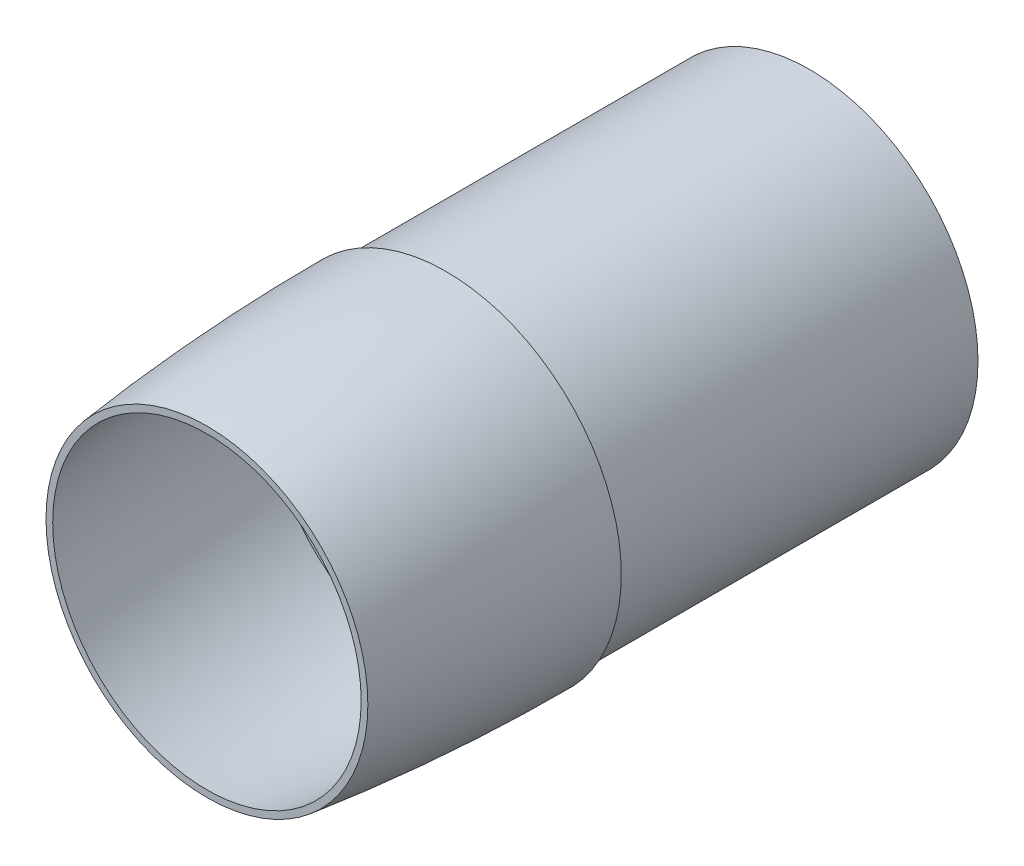
ISO-10303-21;
HEADER;
FILE_DESCRIPTION(('STEP AP214'),'2;1');
FILE_NAME('part.step','',(''),(''),'','','');
FILE_SCHEMA(('AUTOMOTIVE_DESIGN { 1 0 10303 214 1 1 1 1 }'));
ENDSEC;
DATA;
#1=APPLICATION_CONTEXT('core data for automotive mechanical design processes');
#2=APPLICATION_PROTOCOL_DEFINITION('international standard','automotive_design',2000,#1);
#3=PRODUCT_CONTEXT('',#1,'mechanical');
#4=PRODUCT('Part','Part','',(#3));
#5=PRODUCT_RELATED_PRODUCT_CATEGORY('part','',(#4));
#6=PRODUCT_DEFINITION_FORMATION('','',#4);
#7=PRODUCT_DEFINITION_CONTEXT('part definition',#1,'design');
#8=PRODUCT_DEFINITION('design','',#6,#7);
#9=PRODUCT_DEFINITION_SHAPE('','',#8);
#10=(LENGTH_UNIT() NAMED_UNIT(*) SI_UNIT(.MILLI.,.METRE.));
#11=(NAMED_UNIT(*) PLANE_ANGLE_UNIT() SI_UNIT($,.RADIAN.));
#12=(NAMED_UNIT(*) SI_UNIT($,.STERADIAN.) SOLID_ANGLE_UNIT());
#13=UNCERTAINTY_MEASURE_WITH_UNIT(LENGTH_MEASURE(1.E-05),#10,'distance_accuracy_value','');
#14=(GEOMETRIC_REPRESENTATION_CONTEXT(3) GLOBAL_UNCERTAINTY_ASSIGNED_CONTEXT((#13)) GLOBAL_UNIT_ASSIGNED_CONTEXT((#10,
#11,#12)) REPRESENTATION_CONTEXT('',''));
#15=CARTESIAN_POINT('',(0.,0.,0.));
#16=DIRECTION('',(0.,0.,1.));
#17=DIRECTION('',(1.,0.,0.));
#18=AXIS2_PLACEMENT_3D('',#15,#16,#17);
#19=CARTESIAN_POINT('',(0.,457.743902439025,-82.));
#20=DIRECTION('',(0.,0.,-1.));
#21=DIRECTION('',(-1.,0.,0.));
#22=AXIS2_PLACEMENT_3D('',#19,#20,#21);
#23=PLANE('',#22);
#24=CARTESIAN_POINT('',(0.,419.743902439025,-82.));
#25=DIRECTION('',(0.,0.,1.));
#26=DIRECTION('',(1.,0.,0.));
#27=AXIS2_PLACEMENT_3D('',#24,#25,#26);
#28=CIRCLE('',#27,38.);
#29=CARTESIAN_POINT('',(38.,419.743902439025,-82.));
#30=VERTEX_POINT('',#29);
#31=EDGE_CURVE('E10',#30,#30,#28,.T.);
#32=ORIENTED_EDGE('',*,*,#31,.F.);
#33=EDGE_LOOP('',(#32));
#34=FACE_BOUND('',#33,.T.);
#35=ADVANCED_FACE('F37',(#34),#23,.T.);
#36=CARTESIAN_POINT('',(0.,419.743902439025,182.604864626783));
#37=DIRECTION('',(0.,0.,1.));
#38=DIRECTION('',(1.,0.,0.));
#39=AXIS2_PLACEMENT_3D('',#36,#37,#38);
#40=CYLINDRICAL_SURFACE('',#39,38.);
#41=ORIENTED_EDGE('',*,*,#31,.T.);
#42=EDGE_LOOP('',(#41));
#43=FACE_BOUND('',#42,.T.);
#44=CARTESIAN_POINT('',(0.,419.743902439025,0.));
#45=DIRECTION('',(0.,0.,1.));
#46=DIRECTION('',(1.,0.,0.));
#47=AXIS2_PLACEMENT_3D('',#44,#45,#46);
#48=CIRCLE('',#47,38.);
#49=CARTESIAN_POINT('',(38.,419.743902439025,0.));
#50=VERTEX_POINT('',#49);
#51=EDGE_CURVE('E43',#50,#50,#48,.T.);
#52=ORIENTED_EDGE('',*,*,#51,.F.);
#53=EDGE_LOOP('',(#52));
#54=FACE_BOUND('',#53,.T.);
#55=ADVANCED_FACE('F95',(#43,#54),#40,.T.);
#56=CARTESIAN_POINT('',(0.,459.243902439025,0.));
#57=DIRECTION('',(0.,0.,-1.));
#58=DIRECTION('',(-1.,0.,0.));
#59=AXIS2_PLACEMENT_3D('',#56,#57,#58);
#60=PLANE('',#59);
#61=ORIENTED_EDGE('',*,*,#51,.T.);
#62=EDGE_LOOP('',(#61));
#63=FACE_BOUND('',#62,.T.);
#64=CARTESIAN_POINT('',(0.,419.743902439025,0.));
#65=DIRECTION('',(0.,0.,1.));
#66=DIRECTION('',(1.,0.,0.));
#67=AXIS2_PLACEMENT_3D('',#64,#65,#66);
#68=CIRCLE('',#67,39.5);
#69=CARTESIAN_POINT('',(39.5,419.743902439025,0.));
#70=VERTEX_POINT('',#69);
#71=EDGE_CURVE('E47',#70,#70,#68,.T.);
#72=ORIENTED_EDGE('',*,*,#71,.F.);
#73=EDGE_LOOP('',(#72));
#74=FACE_BOUND('',#73,.T.);
#75=ADVANCED_FACE('F100',(#63,#74),#60,.T.);
#76=CARTESIAN_POINT('',(0.,419.743902439025,0.));
#77=DIRECTION('',(0.,0.,1.));
#78=DIRECTION('',(1.,0.,0.));
#79=AXIS2_PLACEMENT_3D('',#76,#77,#78);
#80=DEGENERATE_TOROIDAL_SURFACE('',#79,419.743902439025,459.243902439025,.F.);
#81=CARTESIAN_POINT('',(0.,419.743902439025,54.));
#82=DIRECTION('',(0.,0.,1.));
#83=DIRECTION('',(1.,0.,0.));
#84=AXIS2_PLACEMENT_3D('',#81,#82,#83);
#85=CIRCLE('',#84,36.3141661524918);
#86=CARTESIAN_POINT('',(36.3141661524918,419.743902439025,54.));
#87=VERTEX_POINT('',#86);
#88=EDGE_CURVE('E51',#87,#87,#85,.T.);
#89=ORIENTED_EDGE('',*,*,#88,.F.);
#90=EDGE_LOOP('',(#89));
#91=FACE_BOUND('',#90,.T.);
#92=ORIENTED_EDGE('',*,*,#71,.T.);
#93=EDGE_LOOP('',(#92));
#94=FACE_BOUND('',#93,.T.);
#95=ADVANCED_FACE('F91',(#91,#94),#80,.F.);
#96=CARTESIAN_POINT('',(0.,454.54755550999,54.));
#97=DIRECTION('',(0.,0.,1.));
#98=DIRECTION('',(1.,0.,0.));
#99=AXIS2_PLACEMENT_3D('',#96,#97,#98);
#100=PLANE('',#99);
#101=ORIENTED_EDGE('',*,*,#88,.T.);
#102=EDGE_LOOP('',(#101));
#103=FACE_BOUND('',#102,.T.);
#104=CARTESIAN_POINT('',(0.,419.743902439025,53.9999999999999));
#105=DIRECTION('',(0.,0.,1.));
#106=DIRECTION('',(1.,0.,0.));
#107=AXIS2_PLACEMENT_3D('',#104,#105,#106);
#108=CIRCLE('',#107,34.8036530709652);
#109=CARTESIAN_POINT('',(34.8036530709652,419.743902439025,53.9999999999999));
#110=VERTEX_POINT('',#109);
#111=EDGE_CURVE('E56',#110,#110,#108,.T.);
#112=ORIENTED_EDGE('',*,*,#111,.F.);
#113=EDGE_LOOP('',(#112));
#114=FACE_BOUND('',#113,.T.);
#115=ADVANCED_FACE('F85',(#103,#114),#100,.T.);
#116=CARTESIAN_POINT('',(0.,419.743902439025,0.));
#117=DIRECTION('',(0.,0.,1.));
#118=DIRECTION('',(1.,0.,0.));
#119=AXIS2_PLACEMENT_3D('',#116,#117,#118);
#120=DEGENERATE_TOROIDAL_SURFACE('',#119,419.743902439025,457.743902439025,.F.);
#121=ORIENTED_EDGE('',*,*,#111,.T.);
#122=EDGE_LOOP('',(#121));
#123=FACE_BOUND('',#122,.T.);
#124=CARTESIAN_POINT('',(0.,419.743902439025,3.));
#125=DIRECTION('',(0.,0.,1.));
#126=DIRECTION('',(1.,0.,0.));
#127=AXIS2_PLACEMENT_3D('',#124,#125,#126);
#128=CIRCLE('',#127,37.9901690698672);
#129=CARTESIAN_POINT('',(37.9901690698672,419.743902439025,3.));
#130=VERTEX_POINT('',#129);
#131=EDGE_CURVE('E59',#130,#130,#128,.T.);
#132=ORIENTED_EDGE('',*,*,#131,.F.);
#133=EDGE_LOOP('',(#132));
#134=FACE_BOUND('',#133,.T.);
#135=ADVANCED_FACE('F80',(#123,#134),#120,.T.);
#136=CARTESIAN_POINT('',(0.,457.734071508892,3.));
#137=DIRECTION('',(0.,0.,-1.));
#138=DIRECTION('',(-1.,0.,0.));
#139=AXIS2_PLACEMENT_3D('',#136,#137,#138);
#140=PLANE('',#139);
#141=CARTESIAN_POINT('',(0.,419.743902439025,3.));
#142=DIRECTION('',(0.,0.,1.));
#143=DIRECTION('',(1.,0.,0.));
#144=AXIS2_PLACEMENT_3D('',#141,#142,#143);
#145=CIRCLE('',#144,35.);
#146=CARTESIAN_POINT('',(35.,419.743902439025,3.));
#147=VERTEX_POINT('',#146);
#148=EDGE_CURVE('E62',#147,#147,#145,.T.);
#149=ORIENTED_EDGE('',*,*,#148,.F.);
#150=EDGE_LOOP('',(#149));
#151=FACE_BOUND('',#150,.T.);
#152=ORIENTED_EDGE('',*,*,#131,.T.);
#153=EDGE_LOOP('',(#152));
#154=FACE_BOUND('',#153,.T.);
#155=ADVANCED_FACE('F74',(#151,#154),#140,.F.);
#156=CARTESIAN_POINT('',(0.,419.743902439025,182.604864626783));
#157=DIRECTION('',(0.,0.,1.));
#158=DIRECTION('',(1.,0.,0.));
#159=AXIS2_PLACEMENT_3D('',#156,#157,#158);
#160=CYLINDRICAL_SURFACE('',#159,35.);
#161=CARTESIAN_POINT('',(0.,419.743902439025,-79.));
#162=DIRECTION('',(0.,0.,1.));
#163=DIRECTION('',(1.,0.,0.));
#164=AXIS2_PLACEMENT_3D('',#161,#162,#163);
#165=CIRCLE('',#164,35.);
#166=CARTESIAN_POINT('',(35.,419.743902439025,-79.));
#167=VERTEX_POINT('',#166);
#168=EDGE_CURVE('E65',#167,#167,#165,.T.);
#169=ORIENTED_EDGE('',*,*,#168,.F.);
#170=EDGE_LOOP('',(#169));
#171=FACE_BOUND('',#170,.T.);
#172=ORIENTED_EDGE('',*,*,#148,.T.);
#173=EDGE_LOOP('',(#172));
#174=FACE_BOUND('',#173,.T.);
#175=ADVANCED_FACE('F71',(#171,#174),#160,.F.);
#176=CARTESIAN_POINT('',(0.,454.743902439025,-79.));
#177=DIRECTION('',(0.,0.,-1.));
#178=DIRECTION('',(-1.,0.,0.));
#179=AXIS2_PLACEMENT_3D('',#176,#177,#178);
#180=PLANE('',#179);
#181=ORIENTED_EDGE('',*,*,#168,.T.);
#182=EDGE_LOOP('',(#181));
#183=FACE_BOUND('',#182,.T.);
#184=ADVANCED_FACE('F69',(#183),#180,.F.);
#185=CLOSED_SHELL('',(#35,#55,#75,#95,#115,#135,#155,#175,#184));
#186=MANIFOLD_SOLID_BREP('B2',#185);
#187=ADVANCED_BREP_SHAPE_REPRESENTATION('',(#18,#186),#14);
#188=SHAPE_DEFINITION_REPRESENTATION(#9,#187);
ENDSEC;
END-ISO-10303-21;
